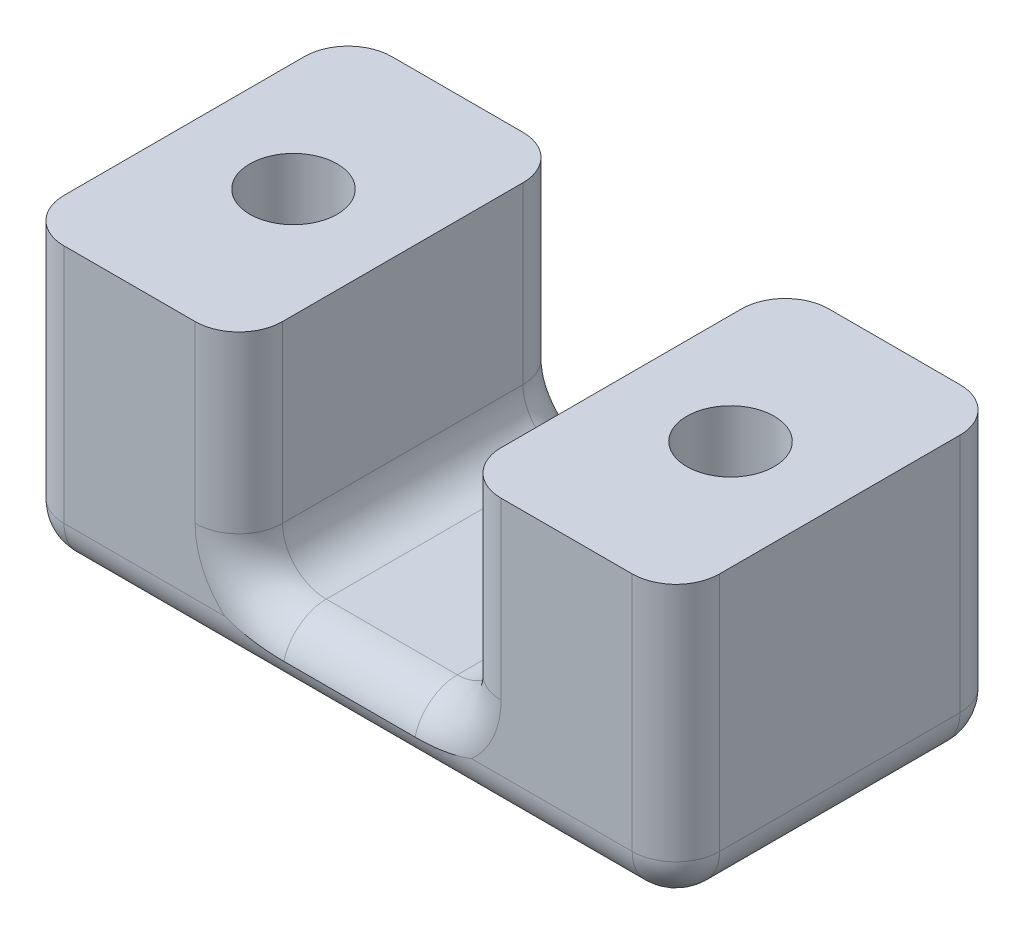
ISO-10303-21;
HEADER;
FILE_DESCRIPTION(('STEP AP214'),'2;1');
FILE_NAME('part.step','',(''),(''),'','','');
FILE_SCHEMA(('AUTOMOTIVE_DESIGN { 1 0 10303 214 1 1 1 1 }'));
ENDSEC;
DATA;
#1=APPLICATION_CONTEXT('core data for automotive mechanical design processes');
#2=APPLICATION_PROTOCOL_DEFINITION('international standard','automotive_design',2000,#1);
#3=PRODUCT_CONTEXT('',#1,'mechanical');
#4=PRODUCT('Part','Part','',(#3));
#5=PRODUCT_RELATED_PRODUCT_CATEGORY('part','',(#4));
#6=PRODUCT_DEFINITION_FORMATION('','',#4);
#7=PRODUCT_DEFINITION_CONTEXT('part definition',#1,'design');
#8=PRODUCT_DEFINITION('design','',#6,#7);
#9=PRODUCT_DEFINITION_SHAPE('','',#8);
#10=(LENGTH_UNIT() NAMED_UNIT(*) SI_UNIT(.MILLI.,.METRE.));
#11=(NAMED_UNIT(*) PLANE_ANGLE_UNIT() SI_UNIT($,.RADIAN.));
#12=(NAMED_UNIT(*) SI_UNIT($,.STERADIAN.) SOLID_ANGLE_UNIT());
#13=UNCERTAINTY_MEASURE_WITH_UNIT(LENGTH_MEASURE(1.E-05),#10,'distance_accuracy_value','');
#14=(GEOMETRIC_REPRESENTATION_CONTEXT(3) GLOBAL_UNCERTAINTY_ASSIGNED_CONTEXT((#13)) GLOBAL_UNIT_ASSIGNED_CONTEXT((#10,
#11,#12)) REPRESENTATION_CONTEXT('',''));
#15=CARTESIAN_POINT('',(0.,0.,0.));
#16=DIRECTION('',(0.,0.,1.));
#17=DIRECTION('',(1.,0.,0.));
#18=AXIS2_PLACEMENT_3D('',#15,#16,#17);
#19=CARTESIAN_POINT('',(0.,3.,-15.));
#20=DIRECTION('',(0.,0.,1.));
#21=DIRECTION('',(1.,0.,0.));
#22=AXIS2_PLACEMENT_3D('',#19,#20,#21);
#23=PLANE('',#22);
#24=CARTESIAN_POINT('',(18.,5.,-15.));
#25=DIRECTION('',(0.,0.,1.));
#26=DIRECTION('',(1.,0.,0.));
#27=AXIS2_PLACEMENT_3D('',#24,#25,#26);
#28=CIRCLE('',#27,4.);
#29=CARTESIAN_POINT('',(20.6457513110646,2.,-15.));
#30=VERTEX_POINT('',#29);
#31=CARTESIAN_POINT('',(22.,5.,-15.));
#32=VERTEX_POINT('',#31);
#33=EDGE_CURVE('E561',#30,#32,#28,.T.);
#34=ORIENTED_EDGE('',*,*,#33,.T.);
#35=DIRECTION('',(0.,-1.,0.));
#36=VECTOR('',#35,1.);
#37=CARTESIAN_POINT('',(22.,3.,-15.));
#38=LINE('',#37,#36);
#39=CARTESIAN_POINT('',(22.,13.,-15.));
#40=VERTEX_POINT('',#39);
#41=EDGE_CURVE('E564',#32,#40,#38,.F.);
#42=ORIENTED_EDGE('',*,*,#41,.T.);
#43=DIRECTION('',(-1.,0.,0.));
#44=VECTOR('',#43,1.);
#45=CARTESIAN_POINT('',(30.,13.,-15.));
#46=LINE('',#45,#44);
#47=CARTESIAN_POINT('',(28.,13.,-15.));
#48=VERTEX_POINT('',#47);
#49=EDGE_CURVE('E443',#48,#40,#46,.T.);
#50=ORIENTED_EDGE('',*,*,#49,.F.);
#51=DIRECTION('',(0.,-1.,0.));
#52=VECTOR('',#51,1.);
#53=CARTESIAN_POINT('',(28.,3.,-15.));
#54=LINE('',#53,#52);
#55=CARTESIAN_POINT('',(28.,2.,-15.));
#56=VERTEX_POINT('',#55);
#57=EDGE_CURVE('E558',#48,#56,#54,.T.);
#58=ORIENTED_EDGE('',*,*,#57,.T.);
#59=DIRECTION('',(-1.,0.,0.));
#60=VECTOR('',#59,1.);
#61=CARTESIAN_POINT('',(0.,2.,-15.));
#62=LINE('',#61,#60);
#63=EDGE_CURVE('E555',#56,#30,#62,.T.);
#64=ORIENTED_EDGE('',*,*,#63,.T.);
#65=EDGE_LOOP('',(#34,#42,#50,#58,#64));
#66=FACE_BOUND('',#65,.T.);
#67=ADVANCED_FACE('F41',(#66),#23,.F.);
#68=CARTESIAN_POINT('',(0.,3.,0.));
#69=DIRECTION('',(0.,0.,-1.));
#70=DIRECTION('',(-1.,0.,0.));
#71=AXIS2_PLACEMENT_3D('',#68,#69,#70);
#72=PLANE('',#71);
#73=CARTESIAN_POINT('',(12.,5.,0.));
#74=DIRECTION('',(0.,0.,-1.));
#75=DIRECTION('',(-1.,0.,0.));
#76=AXIS2_PLACEMENT_3D('',#73,#74,#75);
#77=CIRCLE('',#76,4.);
#78=CARTESIAN_POINT('',(9.35424868893541,2.,0.));
#79=VERTEX_POINT('',#78);
#80=CARTESIAN_POINT('',(8.,5.,0.));
#81=VERTEX_POINT('',#80);
#82=EDGE_CURVE('E505',#79,#81,#77,.T.);
#83=ORIENTED_EDGE('',*,*,#82,.T.);
#84=DIRECTION('',(0.,-1.,0.));
#85=VECTOR('',#84,1.);
#86=CARTESIAN_POINT('',(8.,3.,0.));
#87=LINE('',#86,#85);
#88=CARTESIAN_POINT('',(8.,13.,0.));
#89=VERTEX_POINT('',#88);
#90=EDGE_CURVE('E508',#81,#89,#87,.F.);
#91=ORIENTED_EDGE('',*,*,#90,.T.);
#92=DIRECTION('',(1.,0.,0.));
#93=VECTOR('',#92,1.);
#94=CARTESIAN_POINT('',(0.,13.,0.));
#95=LINE('',#94,#93);
#96=CARTESIAN_POINT('',(2.,13.,0.));
#97=VERTEX_POINT('',#96);
#98=EDGE_CURVE('E460',#97,#89,#95,.T.);
#99=ORIENTED_EDGE('',*,*,#98,.F.);
#100=DIRECTION('',(0.,-1.,0.));
#101=VECTOR('',#100,1.);
#102=CARTESIAN_POINT('',(2.,3.,0.));
#103=LINE('',#102,#101);
#104=CARTESIAN_POINT('',(2.,2.,0.));
#105=VERTEX_POINT('',#104);
#106=EDGE_CURVE('E502',#97,#105,#103,.T.);
#107=ORIENTED_EDGE('',*,*,#106,.T.);
#108=DIRECTION('',(1.,0.,0.));
#109=VECTOR('',#108,1.);
#110=CARTESIAN_POINT('',(30.,2.,0.));
#111=LINE('',#110,#109);
#112=EDGE_CURVE('E499',#105,#79,#111,.T.);
#113=ORIENTED_EDGE('',*,*,#112,.T.);
#114=EDGE_LOOP('',(#83,#91,#99,#107,#113));
#115=FACE_BOUND('',#114,.T.);
#116=ADVANCED_FACE('F621',(#115),#72,.F.);
#117=CARTESIAN_POINT('',(0.,3.,0.));
#118=DIRECTION('',(0.,-1.,0.));
#119=DIRECTION('',(0.,0.,-1.));
#120=AXIS2_PLACEMENT_3D('',#117,#118,#119);
#121=PLANE('',#120);
#122=DIRECTION('',(0.,0.,-1.));
#123=VECTOR('',#122,1.);
#124=CARTESIAN_POINT('',(12.,3.,0.));
#125=LINE('',#124,#123);
#126=CARTESIAN_POINT('',(12.,3.,-13.));
#127=VERTEX_POINT('',#126);
#128=CARTESIAN_POINT('',(12.,3.,-2.));
#129=VERTEX_POINT('',#128);
#130=EDGE_CURVE('E573',#127,#129,#125,.F.);
#131=ORIENTED_EDGE('',*,*,#130,.T.);
#132=DIRECTION('',(1.,0.,0.));
#133=VECTOR('',#132,1.);
#134=CARTESIAN_POINT('',(0.,3.,-2.));
#135=LINE('',#134,#133);
#136=CARTESIAN_POINT('',(18.,3.,-2.));
#137=VERTEX_POINT('',#136);
#138=EDGE_CURVE('E576',#129,#137,#135,.T.);
#139=ORIENTED_EDGE('',*,*,#138,.T.);
#140=DIRECTION('',(0.,0.,1.));
#141=VECTOR('',#140,1.);
#142=CARTESIAN_POINT('',(18.,3.,-15.));
#143=LINE('',#142,#141);
#144=CARTESIAN_POINT('',(18.,3.,-13.));
#145=VERTEX_POINT('',#144);
#146=EDGE_CURVE('E567',#137,#145,#143,.F.);
#147=ORIENTED_EDGE('',*,*,#146,.T.);
#148=DIRECTION('',(-1.,0.,0.));
#149=VECTOR('',#148,1.);
#150=CARTESIAN_POINT('',(0.,3.,-13.));
#151=LINE('',#150,#149);
#152=EDGE_CURVE('E570',#145,#127,#151,.T.);
#153=ORIENTED_EDGE('',*,*,#152,.T.);
#154=EDGE_LOOP('',(#131,#139,#147,#153));
#155=FACE_BOUND('',#154,.T.);
#156=ADVANCED_FACE('F706',(#155),#121,.F.);
#157=CARTESIAN_POINT('',(0.,3.,0.));
#158=DIRECTION('',(1.,0.,0.));
#159=DIRECTION('',(0.,0.,-1.));
#160=AXIS2_PLACEMENT_3D('',#157,#158,#159);
#161=PLANE('',#160);
#162=DIRECTION('',(0.,0.,1.));
#163=VECTOR('',#162,1.);
#164=CARTESIAN_POINT('',(0.,2.,0.));
#165=LINE('',#164,#163);
#166=CARTESIAN_POINT('',(0.,2.,-13.));
#167=VERTEX_POINT('',#166);
#168=CARTESIAN_POINT('',(0.,2.,-2.));
#169=VERTEX_POINT('',#168);
#170=EDGE_CURVE('E52',#167,#169,#165,.T.);
#171=ORIENTED_EDGE('',*,*,#170,.T.);
#172=DIRECTION('',(0.,-1.,0.));
#173=VECTOR('',#172,1.);
#174=CARTESIAN_POINT('',(0.,3.,-2.));
#175=LINE('',#174,#173);
#176=CARTESIAN_POINT('',(0.,13.,-2.));
#177=VERTEX_POINT('',#176);
#178=EDGE_CURVE('E11',#169,#177,#175,.F.);
#179=ORIENTED_EDGE('',*,*,#178,.T.);
#180=DIRECTION('',(0.,0.,1.));
#181=VECTOR('',#180,1.);
#182=CARTESIAN_POINT('',(0.,13.,-15.));
#183=LINE('',#182,#181);
#184=CARTESIAN_POINT('',(0.,13.,-13.));
#185=VERTEX_POINT('',#184);
#186=EDGE_CURVE('E456',#185,#177,#183,.T.);
#187=ORIENTED_EDGE('',*,*,#186,.F.);
#188=DIRECTION('',(0.,-1.,0.));
#189=VECTOR('',#188,1.);
#190=CARTESIAN_POINT('',(0.,3.,-13.));
#191=LINE('',#190,#189);
#192=EDGE_CURVE('E229',#185,#167,#191,.T.);
#193=ORIENTED_EDGE('',*,*,#192,.T.);
#194=EDGE_LOOP('',(#171,#179,#187,#193));
#195=FACE_BOUND('',#194,.T.);
#196=ADVANCED_FACE('F648',(#195),#161,.F.);
#197=DIRECTION('',(1.,0.,0.));
#198=VECTOR('',#197,1.);
#199=CARTESIAN_POINT('',(30.,13.,0.));
#200=LINE('',#199,#198);
#201=CARTESIAN_POINT('',(22.,13.,0.));
#202=VERTEX_POINT('',#201);
#203=CARTESIAN_POINT('',(28.,13.,0.));
#204=VERTEX_POINT('',#203);
#205=EDGE_CURVE('E452',#202,#204,#200,.T.);
#206=ORIENTED_EDGE('',*,*,#205,.F.);
#207=DIRECTION('',(0.,-1.,0.));
#208=VECTOR('',#207,1.);
#209=CARTESIAN_POINT('',(22.,3.,0.));
#210=LINE('',#209,#208);
#211=CARTESIAN_POINT('',(22.,5.,0.));
#212=VERTEX_POINT('',#211);
#213=EDGE_CURVE('E495',#202,#212,#210,.T.);
#214=ORIENTED_EDGE('',*,*,#213,.T.);
#215=CARTESIAN_POINT('',(18.,5.,0.));
#216=DIRECTION('',(0.,0.,-1.));
#217=DIRECTION('',(-1.,0.,0.));
#218=AXIS2_PLACEMENT_3D('',#215,#216,#217);
#219=CIRCLE('',#218,4.);
#220=CARTESIAN_POINT('',(20.6457513110646,2.,0.));
#221=VERTEX_POINT('',#220);
#222=EDGE_CURVE('E492',#212,#221,#219,.T.);
#223=ORIENTED_EDGE('',*,*,#222,.T.);
#224=DIRECTION('',(1.,0.,0.));
#225=VECTOR('',#224,1.);
#226=CARTESIAN_POINT('',(30.,2.,0.));
#227=LINE('',#226,#225);
#228=CARTESIAN_POINT('',(28.,2.,0.));
#229=VERTEX_POINT('',#228);
#230=EDGE_CURVE('E486',#221,#229,#227,.T.);
#231=ORIENTED_EDGE('',*,*,#230,.T.);
#232=DIRECTION('',(0.,-1.,0.));
#233=VECTOR('',#232,1.);
#234=CARTESIAN_POINT('',(28.,3.,0.));
#235=LINE('',#234,#233);
#236=EDGE_CURVE('E489',#229,#204,#235,.F.);
#237=ORIENTED_EDGE('',*,*,#236,.T.);
#238=EDGE_LOOP('',(#206,#214,#223,#231,#237));
#239=FACE_BOUND('',#238,.T.);
#240=ADVANCED_FACE('F597',(#239),#72,.F.);
#241=CARTESIAN_POINT('',(30.,3.,0.));
#242=DIRECTION('',(-1.,0.,0.));
#243=DIRECTION('',(0.,0.,1.));
#244=AXIS2_PLACEMENT_3D('',#241,#242,#243);
#245=PLANE('',#244);
#246=DIRECTION('',(0.,0.,-1.));
#247=VECTOR('',#246,1.);
#248=CARTESIAN_POINT('',(30.,13.,-15.));
#249=LINE('',#248,#247);
#250=CARTESIAN_POINT('',(30.,13.,-2.));
#251=VERTEX_POINT('',#250);
#252=CARTESIAN_POINT('',(30.,13.,-13.));
#253=VERTEX_POINT('',#252);
#254=EDGE_CURVE('E439',#251,#253,#249,.T.);
#255=ORIENTED_EDGE('',*,*,#254,.F.);
#256=DIRECTION('',(0.,-1.,0.));
#257=VECTOR('',#256,1.);
#258=CARTESIAN_POINT('',(30.,3.,-2.));
#259=LINE('',#258,#257);
#260=CARTESIAN_POINT('',(30.,2.,-2.));
#261=VERTEX_POINT('',#260);
#262=EDGE_CURVE('E585',#251,#261,#259,.T.);
#263=ORIENTED_EDGE('',*,*,#262,.T.);
#264=DIRECTION('',(0.,0.,-1.));
#265=VECTOR('',#264,1.);
#266=CARTESIAN_POINT('',(30.,2.,-15.));
#267=LINE('',#266,#265);
#268=CARTESIAN_POINT('',(30.,2.,-13.));
#269=VERTEX_POINT('',#268);
#270=EDGE_CURVE('E248',#261,#269,#267,.T.);
#271=ORIENTED_EDGE('',*,*,#270,.T.);
#272=DIRECTION('',(0.,-1.,0.));
#273=VECTOR('',#272,1.);
#274=CARTESIAN_POINT('',(30.,3.,-13.));
#275=LINE('',#274,#273);
#276=EDGE_CURVE('E582',#269,#253,#275,.F.);
#277=ORIENTED_EDGE('',*,*,#276,.T.);
#278=EDGE_LOOP('',(#255,#263,#271,#277));
#279=FACE_BOUND('',#278,.T.);
#280=ADVANCED_FACE('F591',(#279),#245,.F.);
#281=DIRECTION('',(-1.,0.,0.));
#282=VECTOR('',#281,1.);
#283=CARTESIAN_POINT('',(0.,13.,-15.));
#284=LINE('',#283,#282);
#285=CARTESIAN_POINT('',(8.,13.,-15.));
#286=VERTEX_POINT('',#285);
#287=CARTESIAN_POINT('',(2.,13.,-15.));
#288=VERTEX_POINT('',#287);
#289=EDGE_CURVE('E466',#286,#288,#284,.T.);
#290=ORIENTED_EDGE('',*,*,#289,.F.);
#291=DIRECTION('',(0.,-1.,0.));
#292=VECTOR('',#291,1.);
#293=CARTESIAN_POINT('',(8.,3.,-15.));
#294=LINE('',#293,#292);
#295=CARTESIAN_POINT('',(8.,5.,-15.));
#296=VERTEX_POINT('',#295);
#297=EDGE_CURVE('E552',#286,#296,#294,.T.);
#298=ORIENTED_EDGE('',*,*,#297,.T.);
#299=CARTESIAN_POINT('',(12.,5.,-15.));
#300=DIRECTION('',(0.,0.,1.));
#301=DIRECTION('',(1.,0.,0.));
#302=AXIS2_PLACEMENT_3D('',#299,#300,#301);
#303=CIRCLE('',#302,4.);
#304=CARTESIAN_POINT('',(9.35424868893541,2.,-15.));
#305=VERTEX_POINT('',#304);
#306=EDGE_CURVE('E549',#296,#305,#303,.T.);
#307=ORIENTED_EDGE('',*,*,#306,.T.);
#308=DIRECTION('',(-1.,0.,0.));
#309=VECTOR('',#308,1.);
#310=CARTESIAN_POINT('',(0.,2.,-15.));
#311=LINE('',#310,#309);
#312=CARTESIAN_POINT('',(2.,2.,-15.));
#313=VERTEX_POINT('',#312);
#314=EDGE_CURVE('E543',#305,#313,#311,.T.);
#315=ORIENTED_EDGE('',*,*,#314,.T.);
#316=DIRECTION('',(0.,-1.,0.));
#317=VECTOR('',#316,1.);
#318=CARTESIAN_POINT('',(2.,3.,-15.));
#319=LINE('',#318,#317);
#320=EDGE_CURVE('E546',#313,#288,#319,.F.);
#321=ORIENTED_EDGE('',*,*,#320,.T.);
#322=EDGE_LOOP('',(#290,#298,#307,#315,#321));
#323=FACE_BOUND('',#322,.T.);
#324=ADVANCED_FACE('F638',(#323),#23,.F.);
#325=CARTESIAN_POINT('',(0.,0.,0.));
#326=DIRECTION('',(0.,-1.,0.));
#327=DIRECTION('',(0.,0.,-1.));
#328=AXIS2_PLACEMENT_3D('',#325,#326,#327);
#329=PLANE('',#328);
#330=DIRECTION('',(0.,0.,-1.));
#331=VECTOR('',#330,1.);
#332=CARTESIAN_POINT('',(28.,0.,0.));
#333=LINE('',#332,#331);
#334=CARTESIAN_POINT('',(28.,0.,-13.));
#335=VERTEX_POINT('',#334);
#336=CARTESIAN_POINT('',(28.,0.,-2.));
#337=VERTEX_POINT('',#336);
#338=EDGE_CURVE('E230',#335,#337,#333,.F.);
#339=ORIENTED_EDGE('',*,*,#338,.T.);
#340=DIRECTION('',(1.,0.,0.));
#341=VECTOR('',#340,1.);
#342=CARTESIAN_POINT('',(0.,0.,-2.));
#343=LINE('',#342,#341);
#344=CARTESIAN_POINT('',(2.,0.,-2.));
#345=VERTEX_POINT('',#344);
#346=EDGE_CURVE('E216',#337,#345,#343,.F.);
#347=ORIENTED_EDGE('',*,*,#346,.T.);
#348=DIRECTION('',(0.,0.,1.));
#349=VECTOR('',#348,1.);
#350=CARTESIAN_POINT('',(2.,0.,-15.));
#351=LINE('',#350,#349);
#352=CARTESIAN_POINT('',(2.,0.,-13.));
#353=VERTEX_POINT('',#352);
#354=EDGE_CURVE('E258',#345,#353,#351,.F.);
#355=ORIENTED_EDGE('',*,*,#354,.T.);
#356=DIRECTION('',(-1.,0.,0.));
#357=VECTOR('',#356,1.);
#358=CARTESIAN_POINT('',(30.,0.,-13.));
#359=LINE('',#358,#357);
#360=EDGE_CURVE('E255',#353,#335,#359,.F.);
#361=ORIENTED_EDGE('',*,*,#360,.T.);
#362=EDGE_LOOP('',(#339,#347,#355,#361));
#363=FACE_BOUND('',#362,.T.);
#364=CARTESIAN_POINT('',(5.,0.,-7.5));
#365=DIRECTION('',(0.,-1.,0.));
#366=DIRECTION('',(0.,0.,-1.));
#367=AXIS2_PLACEMENT_3D('',#364,#365,#366);
#368=CIRCLE('',#367,2.);
#369=CARTESIAN_POINT('',(5.,0.,-9.5));
#370=VERTEX_POINT('',#369);
#371=EDGE_CURVE('E430',#370,#370,#368,.T.);
#372=ORIENTED_EDGE('',*,*,#371,.F.);
#373=EDGE_LOOP('',(#372));
#374=FACE_BOUND('',#373,.T.);
#375=CARTESIAN_POINT('',(25.,0.,-7.49999999999999));
#376=DIRECTION('',(0.,-1.,0.));
#377=DIRECTION('',(0.,0.,1.));
#378=AXIS2_PLACEMENT_3D('',#375,#376,#377);
#379=CIRCLE('',#378,2.);
#380=CARTESIAN_POINT('',(25.,0.,-5.49999999999999));
#381=VERTEX_POINT('',#380);
#382=EDGE_CURVE('E425',#381,#381,#379,.T.);
#383=ORIENTED_EDGE('',*,*,#382,.F.);
#384=EDGE_LOOP('',(#383));
#385=FACE_BOUND('',#384,.T.);
#386=ADVANCED_FACE('F252',(#363,#374,#385),#329,.T.);
#387=CARTESIAN_POINT('',(10.,13.,-15.));
#388=DIRECTION('',(-1.,0.,0.));
#389=DIRECTION('',(0.,0.,1.));
#390=AXIS2_PLACEMENT_3D('',#387,#388,#389);
#391=PLANE('',#390);
#392=DIRECTION('',(0.,0.,-1.));
#393=VECTOR('',#392,1.);
#394=CARTESIAN_POINT('',(10.,13.,-15.));
#395=LINE('',#394,#393);
#396=CARTESIAN_POINT('',(10.,13.,-2.));
#397=VERTEX_POINT('',#396);
#398=CARTESIAN_POINT('',(10.,13.,-13.));
#399=VERTEX_POINT('',#398);
#400=EDGE_CURVE('E463',#397,#399,#395,.T.);
#401=ORIENTED_EDGE('',*,*,#400,.F.);
#402=DIRECTION('',(0.,-1.,0.));
#403=VECTOR('',#402,1.);
#404=CARTESIAN_POINT('',(10.,13.,-2.));
#405=LINE('',#404,#403);
#406=CARTESIAN_POINT('',(10.,5.,-2.));
#407=VERTEX_POINT('',#406);
#408=EDGE_CURVE('E482',#397,#407,#405,.T.);
#409=ORIENTED_EDGE('',*,*,#408,.T.);
#410=DIRECTION('',(0.,0.,-1.));
#411=VECTOR('',#410,1.);
#412=CARTESIAN_POINT('',(10.,5.,-15.));
#413=LINE('',#412,#411);
#414=CARTESIAN_POINT('',(10.,5.,-13.));
#415=VERTEX_POINT('',#414);
#416=EDGE_CURVE('E470',#407,#415,#413,.T.);
#417=ORIENTED_EDGE('',*,*,#416,.T.);
#418=DIRECTION('',(0.,-1.,0.));
#419=VECTOR('',#418,1.);
#420=CARTESIAN_POINT('',(10.,13.,-13.));
#421=LINE('',#420,#419);
#422=EDGE_CURVE('E479',#415,#399,#421,.F.);
#423=ORIENTED_EDGE('',*,*,#422,.T.);
#424=EDGE_LOOP('',(#401,#409,#417,#423));
#425=FACE_BOUND('',#424,.T.);
#426=ADVANCED_FACE('F626',(#425),#391,.F.);
#427=CARTESIAN_POINT('',(0.,13.,0.));
#428=DIRECTION('',(0.,1.,0.));
#429=DIRECTION('',(0.,0.,1.));
#430=AXIS2_PLACEMENT_3D('',#427,#428,#429);
#431=PLANE('',#430);
#432=CARTESIAN_POINT('',(5.,13.,-7.5));
#433=DIRECTION('',(0.,1.,0.));
#434=DIRECTION('',(0.,0.,1.));
#435=AXIS2_PLACEMENT_3D('',#432,#433,#434);
#436=CIRCLE('',#435,2.);
#437=CARTESIAN_POINT('',(5.,13.,-5.5));
#438=VERTEX_POINT('',#437);
#439=EDGE_CURVE('E444',#438,#438,#436,.T.);
#440=ORIENTED_EDGE('',*,*,#439,.F.);
#441=EDGE_LOOP('',(#440));
#442=FACE_BOUND('',#441,.T.);
#443=ORIENTED_EDGE('',*,*,#98,.T.);
#444=CARTESIAN_POINT('',(8.,13.,-2.));
#445=DIRECTION('',(0.,1.,0.));
#446=DIRECTION('',(0.,0.,1.));
#447=AXIS2_PLACEMENT_3D('',#444,#445,#446);
#448=CIRCLE('',#447,2.);
#449=EDGE_CURVE('E92',#89,#397,#448,.T.);
#450=ORIENTED_EDGE('',*,*,#449,.T.);
#451=ORIENTED_EDGE('',*,*,#400,.T.);
#452=CARTESIAN_POINT('',(8.,13.,-13.));
#453=DIRECTION('',(0.,1.,0.));
#454=DIRECTION('',(0.,0.,1.));
#455=AXIS2_PLACEMENT_3D('',#452,#453,#454);
#456=CIRCLE('',#455,2.);
#457=EDGE_CURVE('E517',#399,#286,#456,.T.);
#458=ORIENTED_EDGE('',*,*,#457,.T.);
#459=ORIENTED_EDGE('',*,*,#289,.T.);
#460=CARTESIAN_POINT('',(2.,13.,-13.));
#461=DIRECTION('',(0.,1.,0.));
#462=DIRECTION('',(0.,0.,1.));
#463=AXIS2_PLACEMENT_3D('',#460,#461,#462);
#464=CIRCLE('',#463,2.);
#465=EDGE_CURVE('E511',#288,#185,#464,.T.);
#466=ORIENTED_EDGE('',*,*,#465,.T.);
#467=ORIENTED_EDGE('',*,*,#186,.T.);
#468=CARTESIAN_POINT('',(2.,13.,-2.));
#469=DIRECTION('',(0.,1.,0.));
#470=DIRECTION('',(0.,0.,1.));
#471=AXIS2_PLACEMENT_3D('',#468,#469,#470);
#472=CIRCLE('',#471,2.);
#473=EDGE_CURVE('E514',#177,#97,#472,.T.);
#474=ORIENTED_EDGE('',*,*,#473,.T.);
#475=EDGE_LOOP('',(#443,#450,#451,#458,#459,#466,#467,#474));
#476=FACE_BOUND('',#475,.T.);
#477=ADVANCED_FACE('F630',(#442,#476),#431,.T.);
#478=CARTESIAN_POINT('',(20.,13.,-15.));
#479=DIRECTION('',(1.,0.,0.));
#480=DIRECTION('',(0.,0.,-1.));
#481=AXIS2_PLACEMENT_3D('',#478,#479,#480);
#482=PLANE('',#481);
#483=DIRECTION('',(0.,0.,1.));
#484=VECTOR('',#483,1.);
#485=CARTESIAN_POINT('',(20.,5.,0.));
#486=LINE('',#485,#484);
#487=CARTESIAN_POINT('',(20.,5.,-13.));
#488=VERTEX_POINT('',#487);
#489=CARTESIAN_POINT('',(20.,5.,-2.));
#490=VERTEX_POINT('',#489);
#491=EDGE_CURVE('E522',#488,#490,#486,.T.);
#492=ORIENTED_EDGE('',*,*,#491,.T.);
#493=DIRECTION('',(0.,-1.,0.));
#494=VECTOR('',#493,1.);
#495=CARTESIAN_POINT('',(20.,13.,-2.));
#496=LINE('',#495,#494);
#497=CARTESIAN_POINT('',(20.,13.,-2.));
#498=VERTEX_POINT('',#497);
#499=EDGE_CURVE('E528',#490,#498,#496,.F.);
#500=ORIENTED_EDGE('',*,*,#499,.T.);
#501=DIRECTION('',(0.,0.,1.));
#502=VECTOR('',#501,1.);
#503=CARTESIAN_POINT('',(20.,13.,-15.));
#504=LINE('',#503,#502);
#505=CARTESIAN_POINT('',(20.,13.,-13.));
#506=VERTEX_POINT('',#505);
#507=EDGE_CURVE('E448',#506,#498,#504,.T.);
#508=ORIENTED_EDGE('',*,*,#507,.F.);
#509=DIRECTION('',(0.,-1.,0.));
#510=VECTOR('',#509,1.);
#511=CARTESIAN_POINT('',(20.,13.,-13.));
#512=LINE('',#511,#510);
#513=EDGE_CURVE('E525',#506,#488,#512,.T.);
#514=ORIENTED_EDGE('',*,*,#513,.T.);
#515=EDGE_LOOP('',(#492,#500,#508,#514));
#516=FACE_BOUND('',#515,.T.);
#517=ADVANCED_FACE('F680',(#516),#482,.F.);
#518=CARTESIAN_POINT('',(0.,13.,0.));
#519=DIRECTION('',(0.,-1.,0.));
#520=DIRECTION('',(0.,0.,-1.));
#521=AXIS2_PLACEMENT_3D('',#518,#519,#520);
#522=PLANE('',#521);
#523=CARTESIAN_POINT('',(25.,13.,-7.49999999999999));
#524=DIRECTION('',(0.,-1.,0.));
#525=DIRECTION('',(0.,0.,-1.));
#526=AXIS2_PLACEMENT_3D('',#523,#524,#525);
#527=CIRCLE('',#526,2.);
#528=CARTESIAN_POINT('',(25.,13.,-9.49999999999999));
#529=VERTEX_POINT('',#528);
#530=EDGE_CURVE('E436',#529,#529,#527,.T.);
#531=ORIENTED_EDGE('',*,*,#530,.T.);
#532=EDGE_LOOP('',(#531));
#533=FACE_BOUND('',#532,.T.);
#534=ORIENTED_EDGE('',*,*,#507,.T.);
#535=CARTESIAN_POINT('',(22.,13.,-2.));
#536=DIRECTION('',(0.,-1.,0.));
#537=DIRECTION('',(0.,0.,-1.));
#538=AXIS2_PLACEMENT_3D('',#535,#536,#537);
#539=CIRCLE('',#538,2.);
#540=EDGE_CURVE('E540',#498,#202,#539,.F.);
#541=ORIENTED_EDGE('',*,*,#540,.T.);
#542=ORIENTED_EDGE('',*,*,#205,.T.);
#543=CARTESIAN_POINT('',(28.,13.,-2.));
#544=DIRECTION('',(0.,-1.,0.));
#545=DIRECTION('',(0.,0.,-1.));
#546=AXIS2_PLACEMENT_3D('',#543,#544,#545);
#547=CIRCLE('',#546,2.);
#548=EDGE_CURVE('E534',#204,#251,#547,.F.);
#549=ORIENTED_EDGE('',*,*,#548,.T.);
#550=ORIENTED_EDGE('',*,*,#254,.T.);
#551=CARTESIAN_POINT('',(28.,13.,-13.));
#552=DIRECTION('',(0.,-1.,0.));
#553=DIRECTION('',(0.,0.,-1.));
#554=AXIS2_PLACEMENT_3D('',#551,#552,#553);
#555=CIRCLE('',#554,2.);
#556=EDGE_CURVE('E531',#253,#48,#555,.F.);
#557=ORIENTED_EDGE('',*,*,#556,.T.);
#558=ORIENTED_EDGE('',*,*,#49,.T.);
#559=CARTESIAN_POINT('',(22.,13.,-13.));
#560=DIRECTION('',(0.,-1.,0.));
#561=DIRECTION('',(0.,0.,-1.));
#562=AXIS2_PLACEMENT_3D('',#559,#560,#561);
#563=CIRCLE('',#562,2.);
#564=EDGE_CURVE('E537',#40,#506,#563,.F.);
#565=ORIENTED_EDGE('',*,*,#564,.T.);
#566=EDGE_LOOP('',(#534,#541,#542,#549,#550,#557,#558,#565));
#567=FACE_BOUND('',#566,.T.);
#568=ADVANCED_FACE('F600',(#533,#567),#522,.F.);
#569=CARTESIAN_POINT('',(25.,30.,-7.49999999999999));
#570=DIRECTION('',(0.,-1.,0.));
#571=DIRECTION('',(0.,0.,-1.));
#572=AXIS2_PLACEMENT_3D('',#569,#570,#571);
#573=CYLINDRICAL_SURFACE('',#572,2.);
#574=ORIENTED_EDGE('',*,*,#382,.T.);
#575=EDGE_LOOP('',(#574));
#576=FACE_BOUND('',#575,.T.);
#577=ORIENTED_EDGE('',*,*,#530,.F.);
#578=EDGE_LOOP('',(#577));
#579=FACE_BOUND('',#578,.T.);
#580=ADVANCED_FACE('F847',(#576,#579),#573,.F.);
#581=CARTESIAN_POINT('',(5.,30.,-7.5));
#582=DIRECTION('',(0.,-1.,0.));
#583=DIRECTION('',(0.,0.,-1.));
#584=AXIS2_PLACEMENT_3D('',#581,#582,#583);
#585=CYLINDRICAL_SURFACE('',#584,2.);
#586=ORIENTED_EDGE('',*,*,#439,.T.);
#587=EDGE_LOOP('',(#586));
#588=FACE_BOUND('',#587,.T.);
#589=ORIENTED_EDGE('',*,*,#371,.T.);
#590=EDGE_LOOP('',(#589));
#591=FACE_BOUND('',#590,.T.);
#592=ADVANCED_FACE('F837',(#588,#591),#585,.F.);
#593=CARTESIAN_POINT('',(22.,13.,-13.));
#594=DIRECTION('',(0.,-1.,0.));
#595=DIRECTION('',(0.,0.,-1.));
#596=AXIS2_PLACEMENT_3D('',#593,#594,#595);
#597=CYLINDRICAL_SURFACE('',#596,2.);
#598=ORIENTED_EDGE('',*,*,#564,.F.);
#599=ORIENTED_EDGE('',*,*,#41,.F.);
#600=CARTESIAN_POINT('',(22.,5.,-13.));
#601=DIRECTION('',(0.,-1.,0.));
#602=DIRECTION('',(0.,0.,-1.));
#603=AXIS2_PLACEMENT_3D('',#600,#601,#602);
#604=CIRCLE('',#603,2.);
#605=EDGE_CURVE('E45',#488,#32,#604,.T.);
#606=ORIENTED_EDGE('',*,*,#605,.F.);
#607=ORIENTED_EDGE('',*,*,#513,.F.);
#608=EDGE_LOOP('',(#598,#599,#606,#607));
#609=FACE_BOUND('',#608,.T.);
#610=ADVANCED_FACE('F43',(#609),#597,.T.);
#611=CARTESIAN_POINT('',(28.,3.,-13.));
#612=DIRECTION('',(0.,-1.,0.));
#613=DIRECTION('',(0.,0.,-1.));
#614=AXIS2_PLACEMENT_3D('',#611,#612,#613);
#615=CYLINDRICAL_SURFACE('',#614,2.);
#616=ORIENTED_EDGE('',*,*,#556,.F.);
#617=ORIENTED_EDGE('',*,*,#276,.F.);
#618=CARTESIAN_POINT('',(28.,2.,-13.));
#619=DIRECTION('',(0.,-1.,0.));
#620=DIRECTION('',(0.,0.,-1.));
#621=AXIS2_PLACEMENT_3D('',#618,#619,#620);
#622=CIRCLE('',#621,2.);
#623=EDGE_CURVE('E416',#56,#269,#622,.T.);
#624=ORIENTED_EDGE('',*,*,#623,.F.);
#625=ORIENTED_EDGE('',*,*,#57,.F.);
#626=EDGE_LOOP('',(#616,#617,#624,#625));
#627=FACE_BOUND('',#626,.T.);
#628=ADVANCED_FACE('F394',(#627),#615,.T.);
#629=CARTESIAN_POINT('',(18.,5.,-13.));
#630=DIRECTION('',(0.,0.,1.));
#631=DIRECTION('',(1.,0.,0.));
#632=AXIS2_PLACEMENT_3D('',#629,#630,#631);
#633=TOROIDAL_SURFACE('',#632,4.,2.);
#634=ORIENTED_EDGE('',*,*,#605,.T.);
#635=ORIENTED_EDGE('',*,*,#33,.F.);
#636=CARTESIAN_POINT('',(20.6457513110646,2.,-15.));
#637=CARTESIAN_POINT('',(20.6423222120228,1.99870391793359,-14.9999999945555));
#638=CARTESIAN_POINT('',(20.6388922528748,1.99741003510526,-14.9999987348855));
#639=CARTESIAN_POINT('',(20.4269095991489,1.91759999996282,-14.9998441615928));
#640=CARTESIAN_POINT('',(20.2151898093873,1.84722442227896,-14.9951026692215));
#641=CARTESIAN_POINT('',(19.7864961199521,1.72468594461214,-14.9819237700392));
#642=CARTESIAN_POINT('',(19.569518241766,1.67253732726329,-14.9734834764694));
#643=CARTESIAN_POINT('',(19.2394920880938,1.60885464780663,-14.9614970106172));
#644=CARTESIAN_POINT('',(19.1278471323968,1.58996290975099,-14.9575864624403));
#645=CARTESIAN_POINT('',(18.9037636141062,1.55744573961101,-14.9504933722418));
#646=CARTESIAN_POINT('',(18.7913250681309,1.54382019758055,-14.947310815022));
#647=CARTESIAN_POINT('',(18.5658568929229,1.52196347669293,-14.9420644383679));
#648=CARTESIAN_POINT('',(18.4528270657626,1.51373423849609,-14.9400010214537));
#649=CARTESIAN_POINT('',(18.2264667404383,1.5027457637486,-14.9372000830771));
#650=CARTESIAN_POINT('',(18.1131361937777,1.49998747089835,-14.9364627903641));
#651=CARTESIAN_POINT('',(17.9998,1.50000000285714,-14.9364916738414));
#652=B_SPLINE_CURVE_WITH_KNOTS('',3,(#636,#637,#638,#639,#640,#641,#642,#643,#644,#645,#646,
#647,#648,#649,#650,#651),.UNSPECIFIED.,.F.,.F.,(4,2,2,2,2,2,2,4),(0.,0.0109976677345867,
0.679521859995904,1.34856873907154,1.68835817204329,2.02814051060625,2.3680449773924,
2.7080080702615),.UNSPECIFIED.);
#653=CARTESIAN_POINT('',(18.,1.5,-14.9364916731037));
#654=VERTEX_POINT('',#653);
#655=EDGE_CURVE('E84',#654,#30,#652,.F.);
#656=ORIENTED_EDGE('',*,*,#655,.F.);
#657=CARTESIAN_POINT('',(18.,1.,-13.));
#658=DIRECTION('',(1.,0.,0.));
#659=DIRECTION('',(0.,0.,-1.));
#660=AXIS2_PLACEMENT_3D('',#657,#658,#659);
#661=CIRCLE('',#660,2.);
#662=EDGE_CURVE('E673',#145,#654,#661,.F.);
#663=ORIENTED_EDGE('',*,*,#662,.F.);
#664=CARTESIAN_POINT('',(18.,5.,-13.));
#665=DIRECTION('',(0.,0.,1.));
#666=DIRECTION('',(1.,0.,0.));
#667=AXIS2_PLACEMENT_3D('',#664,#665,#666);
#668=CIRCLE('',#667,2.);
#669=EDGE_CURVE('E668',#488,#145,#668,.F.);
#670=ORIENTED_EDGE('',*,*,#669,.F.);
#671=EDGE_LOOP('',(#634,#635,#656,#663,#670));
#672=FACE_BOUND('',#671,.T.);
#673=ADVANCED_FACE('F389',(#672),#633,.T.);
#674=CARTESIAN_POINT('',(28.,2.,-13.));
#675=DIRECTION('',(0.,0.,1.));
#676=DIRECTION('',(1.,0.,0.));
#677=AXIS2_PLACEMENT_3D('',#674,#675,#676);
#678=SPHERICAL_SURFACE('',#677,2.);
#679=CARTESIAN_POINT('',(28.,2.,-13.));
#680=DIRECTION('',(0.,0.,-1.));
#681=DIRECTION('',(-1.,0.,0.));
#682=AXIS2_PLACEMENT_3D('',#679,#680,#681);
#683=CIRCLE('',#682,2.);
#684=EDGE_CURVE('E665',#335,#269,#683,.F.);
#685=ORIENTED_EDGE('',*,*,#684,.F.);
#686=CARTESIAN_POINT('',(28.,2.,-13.));
#687=DIRECTION('',(1.,0.,0.));
#688=DIRECTION('',(0.,0.,-1.));
#689=AXIS2_PLACEMENT_3D('',#686,#687,#688);
#690=CIRCLE('',#689,2.);
#691=EDGE_CURVE('E405',#56,#335,#690,.F.);
#692=ORIENTED_EDGE('',*,*,#691,.F.);
#693=ORIENTED_EDGE('',*,*,#623,.T.);
#694=EDGE_LOOP('',(#685,#692,#693));
#695=FACE_BOUND('',#694,.T.);
#696=ADVANCED_FACE('F393',(#695),#678,.T.);
#697=CARTESIAN_POINT('',(2.,3.,-13.));
#698=DIRECTION('',(0.,-1.,0.));
#699=DIRECTION('',(0.,0.,-1.));
#700=AXIS2_PLACEMENT_3D('',#697,#698,#699);
#701=CYLINDRICAL_SURFACE('',#700,2.);
#702=CARTESIAN_POINT('',(2.,2.,-13.));
#703=DIRECTION('',(0.,-1.,0.));
#704=DIRECTION('',(0.,0.,-1.));
#705=AXIS2_PLACEMENT_3D('',#702,#703,#704);
#706=CIRCLE('',#705,2.);
#707=EDGE_CURVE('E413',#167,#313,#706,.T.);
#708=ORIENTED_EDGE('',*,*,#707,.F.);
#709=ORIENTED_EDGE('',*,*,#192,.F.);
#710=ORIENTED_EDGE('',*,*,#465,.F.);
#711=ORIENTED_EDGE('',*,*,#320,.F.);
#712=EDGE_LOOP('',(#708,#709,#710,#711));
#713=FACE_BOUND('',#712,.T.);
#714=ADVANCED_FACE('F646',(#713),#701,.T.);
#715=CARTESIAN_POINT('',(2.,2.,-13.));
#716=DIRECTION('',(0.,0.,1.));
#717=DIRECTION('',(1.,0.,0.));
#718=AXIS2_PLACEMENT_3D('',#715,#716,#717);
#719=SPHERICAL_SURFACE('',#718,2.);
#720=CARTESIAN_POINT('',(2.,2.,-13.));
#721=DIRECTION('',(0.,0.,-1.));
#722=DIRECTION('',(-1.,0.,0.));
#723=AXIS2_PLACEMENT_3D('',#720,#721,#722);
#724=CIRCLE('',#723,2.);
#725=EDGE_CURVE('E662',#167,#353,#724,.F.);
#726=ORIENTED_EDGE('',*,*,#725,.F.);
#727=ORIENTED_EDGE('',*,*,#707,.T.);
#728=CARTESIAN_POINT('',(2.,2.,-13.));
#729=DIRECTION('',(-1.,0.,0.));
#730=DIRECTION('',(0.,0.,1.));
#731=AXIS2_PLACEMENT_3D('',#728,#729,#730);
#732=CIRCLE('',#731,2.);
#733=EDGE_CURVE('E409',#353,#313,#732,.F.);
#734=ORIENTED_EDGE('',*,*,#733,.F.);
#735=EDGE_LOOP('',(#726,#727,#734));
#736=FACE_BOUND('',#735,.T.);
#737=ADVANCED_FACE('F692',(#736),#719,.T.);
#738=CARTESIAN_POINT('',(8.,3.,-13.));
#739=DIRECTION('',(0.,-1.,0.));
#740=DIRECTION('',(0.,0.,-1.));
#741=AXIS2_PLACEMENT_3D('',#738,#739,#740);
#742=CYLINDRICAL_SURFACE('',#741,2.);
#743=ORIENTED_EDGE('',*,*,#457,.F.);
#744=ORIENTED_EDGE('',*,*,#422,.F.);
#745=CARTESIAN_POINT('',(8.,5.,-13.));
#746=DIRECTION('',(0.,-1.,0.));
#747=DIRECTION('',(0.,0.,-1.));
#748=AXIS2_PLACEMENT_3D('',#745,#746,#747);
#749=CIRCLE('',#748,2.);
#750=EDGE_CURVE('E351',#296,#415,#749,.T.);
#751=ORIENTED_EDGE('',*,*,#750,.F.);
#752=ORIENTED_EDGE('',*,*,#297,.F.);
#753=EDGE_LOOP('',(#743,#744,#751,#752));
#754=FACE_BOUND('',#753,.T.);
#755=ADVANCED_FACE('F360',(#754),#742,.T.);
#756=CARTESIAN_POINT('',(0.,2.,-13.));
#757=DIRECTION('',(1.,0.,0.));
#758=DIRECTION('',(0.,0.,-1.));
#759=AXIS2_PLACEMENT_3D('',#756,#757,#758);
#760=CYLINDRICAL_SURFACE('',#759,2.);
#761=DIRECTION('',(1.,0.,0.));
#762=VECTOR('',#761,1.);
#763=CARTESIAN_POINT('',(15.,1.5,-14.9364916731037));
#764=LINE('',#763,#762);
#765=CARTESIAN_POINT('',(11.9999999999912,1.49999999999997,-14.9364916731038));
#766=VERTEX_POINT('',#765);
#767=EDGE_CURVE('E76',#654,#766,#764,.F.);
#768=ORIENTED_EDGE('',*,*,#767,.F.);
#769=ORIENTED_EDGE('',*,*,#655,.T.);
#770=ORIENTED_EDGE('',*,*,#63,.F.);
#771=ORIENTED_EDGE('',*,*,#691,.T.);
#772=ORIENTED_EDGE('',*,*,#360,.F.);
#773=ORIENTED_EDGE('',*,*,#733,.T.);
#774=ORIENTED_EDGE('',*,*,#314,.F.);
#775=CARTESIAN_POINT('',(12.0002,1.50000000285714,-14.9364916738414));
#776=CARTESIAN_POINT('',(11.9155298489346,1.4999946533271,-14.936482185426));
#777=CARTESIAN_POINT('',(11.8308612394938,1.501531308793,-14.9368868598503));
#778=CARTESIAN_POINT('',(11.6616471702097,1.50766682272494,-14.9384597905505));
#779=CARTESIAN_POINT('',(11.5771017031005,1.5122654925229,-14.9396279997806));
#780=CARTESIAN_POINT('',(11.4082705737404,1.52450127237993,-14.9426627848052));
#781=CARTESIAN_POINT('',(11.3239848369291,1.53213740848001,-14.9445291367299));
#782=CARTESIAN_POINT('',(11.1557565404687,1.55040495847369,-14.9488333550249));
#783=CARTESIAN_POINT('',(11.0718139840035,1.56103640009298,-14.9512712266853));
#784=CARTESIAN_POINT('',(10.8212565842908,1.59725875168252,-14.9591883678259));
#785=CARTESIAN_POINT('',(10.6552760789884,1.62722447994387,-14.965284817274));
#786=CARTESIAN_POINT('',(10.3257696405307,1.69827855401497,-14.9774368119938));
#787=CARTESIAN_POINT('',(10.1622431545788,1.73936435396511,-14.9834923663033));
#788=CARTESIAN_POINT('',(9.89286259321883,1.81632149708528,-14.9917856612753));
#789=CARTESIAN_POINT('',(9.78618065859887,1.84926856548161,-14.9946220977712));
#790=CARTESIAN_POINT('',(9.5742507554709,1.91950274288118,-14.9986889712243));
#791=CARTESIAN_POINT('',(9.46900231309399,1.95678837677832,-14.9999199523064));
#792=CARTESIAN_POINT('',(9.36110775798932,1.99741003377735,-14.9999987384288));
#793=CARTESIAN_POINT('',(9.35767779875108,1.99870391667705,-14.99999999819));
#794=CARTESIAN_POINT('',(9.35424868893541,2.,-15.));
#795=B_SPLINE_CURVE_WITH_KNOTS('',3,(#775,#776,#777,#778,#779,#780,#781,#782,#783,#784,#785,
#786,#787,#788,#789,#790,#791,#792,#793,#794),.UNSPECIFIED.,.F.,.F.,(4,2,2,2,2,2,2,2,2,4),(0.,
0.25399279370541,0.507969938922853,0.761865712313081,1.01576383593605,1.52165113744941,
2.02742271756793,2.36240153744948,2.69726679597799,2.70826446371257),.UNSPECIFIED.);
#796=EDGE_CURVE('E341',#766,#305,#795,.T.);
#797=ORIENTED_EDGE('',*,*,#796,.F.);
#798=EDGE_LOOP('',(#768,#769,#770,#771,#772,#773,#774,#797));
#799=FACE_BOUND('',#798,.T.);
#800=ADVANCED_FACE('F355',(#799),#760,.T.);
#801=CARTESIAN_POINT('',(0.,1.,-13.));
#802=DIRECTION('',(-1.,0.,0.));
#803=DIRECTION('',(0.,0.,1.));
#804=AXIS2_PLACEMENT_3D('',#801,#802,#803);
#805=CYLINDRICAL_SURFACE('',#804,2.);
#806=ORIENTED_EDGE('',*,*,#662,.T.);
#807=ORIENTED_EDGE('',*,*,#767,.T.);
#808=CARTESIAN_POINT('',(12.,1.,-13.));
#809=DIRECTION('',(-1.,0.,0.));
#810=DIRECTION('',(0.,0.,1.));
#811=AXIS2_PLACEMENT_3D('',#808,#809,#810);
#812=CIRCLE('',#811,2.);
#813=EDGE_CURVE('E337',#127,#766,#812,.T.);
#814=ORIENTED_EDGE('',*,*,#813,.F.);
#815=ORIENTED_EDGE('',*,*,#152,.F.);
#816=EDGE_LOOP('',(#806,#807,#814,#815));
#817=FACE_BOUND('',#816,.T.);
#818=ADVANCED_FACE('F359',(#817),#805,.T.);
#819=CARTESIAN_POINT('',(18.,5.,-15.));
#820=DIRECTION('',(0.,0.,-1.));
#821=DIRECTION('',(-1.,0.,0.));
#822=AXIS2_PLACEMENT_3D('',#819,#820,#821);
#823=CYLINDRICAL_SURFACE('',#822,2.);
#824=ORIENTED_EDGE('',*,*,#669,.T.);
#825=ORIENTED_EDGE('',*,*,#146,.F.);
#826=CARTESIAN_POINT('',(18.,5.,-2.));
#827=DIRECTION('',(0.,0.,-1.));
#828=DIRECTION('',(-1.,0.,0.));
#829=AXIS2_PLACEMENT_3D('',#826,#827,#828);
#830=CIRCLE('',#829,2.);
#831=EDGE_CURVE('E333',#490,#137,#830,.T.);
#832=ORIENTED_EDGE('',*,*,#831,.F.);
#833=ORIENTED_EDGE('',*,*,#491,.F.);
#834=EDGE_LOOP('',(#824,#825,#832,#833));
#835=FACE_BOUND('',#834,.T.);
#836=ADVANCED_FACE('F382',(#835),#823,.F.);
#837=CARTESIAN_POINT('',(22.,3.,-2.));
#838=DIRECTION('',(0.,-1.,0.));
#839=DIRECTION('',(0.,0.,-1.));
#840=AXIS2_PLACEMENT_3D('',#837,#838,#839);
#841=CYLINDRICAL_SURFACE('',#840,2.);
#842=ORIENTED_EDGE('',*,*,#540,.F.);
#843=ORIENTED_EDGE('',*,*,#499,.F.);
#844=CARTESIAN_POINT('',(22.,5.,-2.));
#845=DIRECTION('',(0.,-1.,0.));
#846=DIRECTION('',(0.,0.,-1.));
#847=AXIS2_PLACEMENT_3D('',#844,#845,#846);
#848=CIRCLE('',#847,2.);
#849=EDGE_CURVE('E329',#212,#490,#848,.T.);
#850=ORIENTED_EDGE('',*,*,#849,.F.);
#851=ORIENTED_EDGE('',*,*,#213,.F.);
#852=EDGE_LOOP('',(#842,#843,#850,#851));
#853=FACE_BOUND('',#852,.T.);
#854=ADVANCED_FACE('F378',(#853),#841,.T.);
#855=CARTESIAN_POINT('',(28.,3.,-2.));
#856=DIRECTION('',(0.,-1.,0.));
#857=DIRECTION('',(0.,0.,-1.));
#858=AXIS2_PLACEMENT_3D('',#855,#856,#857);
#859=CYLINDRICAL_SURFACE('',#858,2.);
#860=ORIENTED_EDGE('',*,*,#548,.F.);
#861=ORIENTED_EDGE('',*,*,#236,.F.);
#862=CARTESIAN_POINT('',(28.,2.,-2.));
#863=DIRECTION('',(0.,-1.,0.));
#864=DIRECTION('',(0.,0.,-1.));
#865=AXIS2_PLACEMENT_3D('',#862,#863,#864);
#866=CIRCLE('',#865,2.);
#867=EDGE_CURVE('E239',#261,#229,#866,.T.);
#868=ORIENTED_EDGE('',*,*,#867,.F.);
#869=ORIENTED_EDGE('',*,*,#262,.F.);
#870=EDGE_LOOP('',(#860,#861,#868,#869));
#871=FACE_BOUND('',#870,.T.);
#872=ADVANCED_FACE('F375',(#871),#859,.T.);
#873=CARTESIAN_POINT('',(28.,2.,0.));
#874=DIRECTION('',(0.,0.,1.));
#875=DIRECTION('',(1.,0.,0.));
#876=AXIS2_PLACEMENT_3D('',#873,#874,#875);
#877=CYLINDRICAL_SURFACE('',#876,2.);
#878=ORIENTED_EDGE('',*,*,#684,.T.);
#879=ORIENTED_EDGE('',*,*,#270,.F.);
#880=CARTESIAN_POINT('',(28.,2.,-2.));
#881=DIRECTION('',(0.,0.,1.));
#882=DIRECTION('',(1.,0.,0.));
#883=AXIS2_PLACEMENT_3D('',#880,#881,#882);
#884=CIRCLE('',#883,2.);
#885=EDGE_CURVE('E237',#337,#261,#884,.T.);
#886=ORIENTED_EDGE('',*,*,#885,.F.);
#887=ORIENTED_EDGE('',*,*,#338,.F.);
#888=EDGE_LOOP('',(#878,#879,#886,#887));
#889=FACE_BOUND('',#888,.T.);
#890=ADVANCED_FACE('F247',(#889),#877,.T.);
#891=CARTESIAN_POINT('',(2.,2.,0.));
#892=DIRECTION('',(0.,0.,-1.));
#893=DIRECTION('',(-1.,0.,0.));
#894=AXIS2_PLACEMENT_3D('',#891,#892,#893);
#895=CYLINDRICAL_SURFACE('',#894,2.);
#896=ORIENTED_EDGE('',*,*,#725,.T.);
#897=ORIENTED_EDGE('',*,*,#354,.F.);
#898=CARTESIAN_POINT('',(2.,2.,-2.));
#899=DIRECTION('',(0.,0.,1.));
#900=DIRECTION('',(1.,0.,0.));
#901=AXIS2_PLACEMENT_3D('',#898,#899,#900);
#902=CIRCLE('',#901,2.);
#903=EDGE_CURVE('E250',#169,#345,#902,.T.);
#904=ORIENTED_EDGE('',*,*,#903,.F.);
#905=ORIENTED_EDGE('',*,*,#170,.F.);
#906=EDGE_LOOP('',(#896,#897,#904,#905));
#907=FACE_BOUND('',#906,.T.);
#908=ADVANCED_FACE('F368',(#907),#895,.T.);
#909=CARTESIAN_POINT('',(2.,3.,-2.));
#910=DIRECTION('',(0.,-1.,0.));
#911=DIRECTION('',(0.,0.,-1.));
#912=AXIS2_PLACEMENT_3D('',#909,#910,#911);
#913=CYLINDRICAL_SURFACE('',#912,2.);
#914=ORIENTED_EDGE('',*,*,#473,.F.);
#915=ORIENTED_EDGE('',*,*,#178,.F.);
#916=CARTESIAN_POINT('',(2.,2.,-2.));
#917=DIRECTION('',(0.,-1.,0.));
#918=DIRECTION('',(0.,0.,-1.));
#919=AXIS2_PLACEMENT_3D('',#916,#917,#918);
#920=CIRCLE('',#919,2.);
#921=EDGE_CURVE('E320',#105,#169,#920,.T.);
#922=ORIENTED_EDGE('',*,*,#921,.F.);
#923=ORIENTED_EDGE('',*,*,#106,.F.);
#924=EDGE_LOOP('',(#914,#915,#922,#923));
#925=FACE_BOUND('',#924,.T.);
#926=ADVANCED_FACE('F364',(#925),#913,.T.);
#927=CARTESIAN_POINT('',(12.,5.,-13.));
#928=DIRECTION('',(0.,0.,1.));
#929=DIRECTION('',(1.,0.,0.));
#930=AXIS2_PLACEMENT_3D('',#927,#928,#929);
#931=TOROIDAL_SURFACE('',#930,4.,2.);
#932=ORIENTED_EDGE('',*,*,#306,.F.);
#933=ORIENTED_EDGE('',*,*,#750,.T.);
#934=CARTESIAN_POINT('',(12.,5.,-13.));
#935=DIRECTION('',(0.,0.,1.));
#936=DIRECTION('',(1.,0.,0.));
#937=AXIS2_PLACEMENT_3D('',#934,#935,#936);
#938=CIRCLE('',#937,2.);
#939=EDGE_CURVE('E316',#127,#415,#938,.F.);
#940=ORIENTED_EDGE('',*,*,#939,.F.);
#941=ORIENTED_EDGE('',*,*,#813,.T.);
#942=ORIENTED_EDGE('',*,*,#796,.T.);
#943=EDGE_LOOP('',(#932,#933,#940,#941,#942));
#944=FACE_BOUND('',#943,.T.);
#945=ADVANCED_FACE('F298',(#944),#931,.T.);
#946=CARTESIAN_POINT('',(18.,5.,-2.));
#947=DIRECTION('',(0.,0.,-1.));
#948=DIRECTION('',(-1.,0.,0.));
#949=AXIS2_PLACEMENT_3D('',#946,#947,#948);
#950=TOROIDAL_SURFACE('',#949,4.,2.);
#951=ORIENTED_EDGE('',*,*,#849,.T.);
#952=ORIENTED_EDGE('',*,*,#831,.T.);
#953=CARTESIAN_POINT('',(18.,1.,-2.));
#954=DIRECTION('',(1.,0.,0.));
#955=DIRECTION('',(0.,0.,-1.));
#956=AXIS2_PLACEMENT_3D('',#953,#954,#955);
#957=CIRCLE('',#956,2.);
#958=CARTESIAN_POINT('',(17.9999999999912,1.5,-0.0635083268962912));
#959=VERTEX_POINT('',#958);
#960=EDGE_CURVE('E313',#959,#137,#957,.F.);
#961=ORIENTED_EDGE('',*,*,#960,.F.);
#962=CARTESIAN_POINT('',(17.9998,1.50000000285714,-0.0635083261585803));
#963=CARTESIAN_POINT('',(18.0844701510653,1.4999946533271,-0.0635178145739785));
#964=CARTESIAN_POINT('',(18.1691387605061,1.501531308793,-0.0631131401496853));
#965=CARTESIAN_POINT('',(18.3383528297901,1.50766682272493,-0.061540209449525));
#966=CARTESIAN_POINT('',(18.4228982968993,1.51226549252288,-0.0603720002194475));
#967=CARTESIAN_POINT('',(18.5917294262593,1.52450127237991,-0.0573372151948235));
#968=CARTESIAN_POINT('',(18.6760151630706,1.53213740847997,-0.0554708632701037));
#969=CARTESIAN_POINT('',(18.8442434595309,1.55040495847363,-0.0511666449751123));
#970=CARTESIAN_POINT('',(18.928186015996,1.56103640009292,-0.0487287733146726));
#971=CARTESIAN_POINT('',(19.1787434157088,1.59725875168245,-0.0408116321741591));
#972=CARTESIAN_POINT('',(19.3447239210113,1.62722447994382,-0.034715182726018));
#973=CARTESIAN_POINT('',(19.6742303594691,1.69827855401492,-0.0225631880062061));
#974=CARTESIAN_POINT('',(19.8377568454212,1.73936435396505,-0.0165076336967357));
#975=CARTESIAN_POINT('',(20.1071374067812,1.8163214970853,-0.00821433872465353));
#976=CARTESIAN_POINT('',(20.2138193414011,1.84926856548169,-0.00537790222884774));
#977=CARTESIAN_POINT('',(20.4257492445291,1.91950274288111,-0.00131102877573701));
#978=CARTESIAN_POINT('',(20.5309976869061,1.95678837677804,-8.00476936358588E-05));
#979=CARTESIAN_POINT('',(20.6388922420107,1.99741003377733,-1.26157121803116E-06));
#980=CARTESIAN_POINT('',(20.6423222012489,1.99870391667704,-1.80998510661804E-09));
#981=CARTESIAN_POINT('',(20.6457513110646,2.,0.));
#982=B_SPLINE_CURVE_WITH_KNOTS('',3,(#962,#963,#964,#965,#966,#967,#968,#969,#970,#971,#972,
#973,#974,#975,#976,#977,#978,#979,#980,#981),.UNSPECIFIED.,.F.,.F.,(4,2,2,2,2,2,2,2,2,4),(0.,
0.253992793705268,0.507969938922574,0.76186571231268,1.01576383593552,1.52165113744915,
2.02742271756793,2.36240153744949,2.69726679597797,2.70826446371256),.UNSPECIFIED.);
#983=EDGE_CURVE('E241',#221,#959,#982,.F.);
#984=ORIENTED_EDGE('',*,*,#983,.F.);
#985=ORIENTED_EDGE('',*,*,#222,.F.);
#986=EDGE_LOOP('',(#951,#952,#961,#984,#985));
#987=FACE_BOUND('',#986,.T.);
#988=ADVANCED_FACE('F294',(#987),#950,.T.);
#989=CARTESIAN_POINT('',(28.,2.,-2.));
#990=DIRECTION('',(0.,0.,1.));
#991=DIRECTION('',(1.,0.,0.));
#992=AXIS2_PLACEMENT_3D('',#989,#990,#991);
#993=SPHERICAL_SURFACE('',#992,2.);
#994=ORIENTED_EDGE('',*,*,#885,.T.);
#995=ORIENTED_EDGE('',*,*,#867,.T.);
#996=CARTESIAN_POINT('',(28.,2.,-2.));
#997=DIRECTION('',(1.,0.,0.));
#998=DIRECTION('',(0.,0.,-1.));
#999=AXIS2_PLACEMENT_3D('',#996,#997,#998);
#1000=CIRCLE('',#999,2.);
#1001=EDGE_CURVE('E221',#337,#229,#1000,.F.);
#1002=ORIENTED_EDGE('',*,*,#1001,.F.);
#1003=EDGE_LOOP('',(#994,#995,#1002));
#1004=FACE_BOUND('',#1003,.T.);
#1005=ADVANCED_FACE('F236',(#1004),#993,.T.);
#1006=CARTESIAN_POINT('',(2.,2.,-2.));
#1007=DIRECTION('',(0.,0.,1.));
#1008=DIRECTION('',(1.,0.,0.));
#1009=AXIS2_PLACEMENT_3D('',#1006,#1007,#1008);
#1010=SPHERICAL_SURFACE('',#1009,2.);
#1011=ORIENTED_EDGE('',*,*,#921,.T.);
#1012=ORIENTED_EDGE('',*,*,#903,.T.);
#1013=CARTESIAN_POINT('',(2.,2.,-2.));
#1014=DIRECTION('',(-1.,0.,0.));
#1015=DIRECTION('',(0.,0.,1.));
#1016=AXIS2_PLACEMENT_3D('',#1013,#1014,#1015);
#1017=CIRCLE('',#1016,2.);
#1018=EDGE_CURVE('E224',#105,#345,#1017,.F.);
#1019=ORIENTED_EDGE('',*,*,#1018,.F.);
#1020=EDGE_LOOP('',(#1011,#1012,#1019));
#1021=FACE_BOUND('',#1020,.T.);
#1022=ADVANCED_FACE('F654',(#1021),#1010,.T.);
#1023=CARTESIAN_POINT('',(12.,5.,-15.));
#1024=DIRECTION('',(0.,0.,1.));
#1025=DIRECTION('',(1.,0.,0.));
#1026=AXIS2_PLACEMENT_3D('',#1023,#1024,#1025);
#1027=CYLINDRICAL_SURFACE('',#1026,2.);
#1028=ORIENTED_EDGE('',*,*,#939,.T.);
#1029=ORIENTED_EDGE('',*,*,#416,.F.);
#1030=CARTESIAN_POINT('',(12.,5.,-2.));
#1031=DIRECTION('',(0.,0.,-1.));
#1032=DIRECTION('',(-1.,0.,0.));
#1033=AXIS2_PLACEMENT_3D('',#1030,#1031,#1032);
#1034=CIRCLE('',#1033,2.);
#1035=EDGE_CURVE('E617',#129,#407,#1034,.T.);
#1036=ORIENTED_EDGE('',*,*,#1035,.F.);
#1037=ORIENTED_EDGE('',*,*,#130,.F.);
#1038=EDGE_LOOP('',(#1028,#1029,#1036,#1037));
#1039=FACE_BOUND('',#1038,.T.);
#1040=ADVANCED_FACE('F659',(#1039),#1027,.F.);
#1041=CARTESIAN_POINT('',(0.,1.,-2.));
#1042=DIRECTION('',(1.,0.,0.));
#1043=DIRECTION('',(0.,0.,-1.));
#1044=AXIS2_PLACEMENT_3D('',#1041,#1042,#1043);
#1045=CYLINDRICAL_SURFACE('',#1044,2.);
#1046=DIRECTION('',(-1.,0.,0.));
#1047=VECTOR('',#1046,1.);
#1048=CARTESIAN_POINT('',(15.,1.5,-0.0635083268962914));
#1049=LINE('',#1048,#1047);
#1050=CARTESIAN_POINT('',(12.,1.5,-0.0635083268962914));
#1051=VERTEX_POINT('',#1050);
#1052=EDGE_CURVE('E309',#959,#1051,#1049,.T.);
#1053=ORIENTED_EDGE('',*,*,#1052,.F.);
#1054=ORIENTED_EDGE('',*,*,#960,.T.);
#1055=ORIENTED_EDGE('',*,*,#138,.F.);
#1056=CARTESIAN_POINT('',(12.,1.,-2.));
#1057=DIRECTION('',(-1.,0.,0.));
#1058=DIRECTION('',(0.,0.,1.));
#1059=AXIS2_PLACEMENT_3D('',#1056,#1057,#1058);
#1060=CIRCLE('',#1059,2.);
#1061=EDGE_CURVE('E281',#1051,#129,#1060,.T.);
#1062=ORIENTED_EDGE('',*,*,#1061,.F.);
#1063=EDGE_LOOP('',(#1053,#1054,#1055,#1062));
#1064=FACE_BOUND('',#1063,.T.);
#1065=ADVANCED_FACE('F289',(#1064),#1045,.T.);
#1066=CARTESIAN_POINT('',(0.,2.,-2.));
#1067=DIRECTION('',(-1.,0.,0.));
#1068=DIRECTION('',(0.,0.,1.));
#1069=AXIS2_PLACEMENT_3D('',#1066,#1067,#1068);
#1070=CYLINDRICAL_SURFACE('',#1069,2.);
#1071=ORIENTED_EDGE('',*,*,#983,.T.);
#1072=ORIENTED_EDGE('',*,*,#1052,.T.);
#1073=CARTESIAN_POINT('',(9.35424868893541,2.,0.));
#1074=CARTESIAN_POINT('',(9.35767778797725,1.99870391793363,-5.44451303952854E-09));
#1075=CARTESIAN_POINT('',(9.36110774712525,1.99741003510534,-1.26511453986279E-06));
#1076=CARTESIAN_POINT('',(9.57309040085219,1.91759999996503,-0.000155838407199813));
#1077=CARTESIAN_POINT('',(9.78481019061342,1.84722442227939,-0.00489733077848474));
#1078=CARTESIAN_POINT('',(10.2135038800486,1.7246859446113,-0.0180762299608205));
#1079=CARTESIAN_POINT('',(10.430481758235,1.67253732726294,-0.0265165235306301));
#1080=CARTESIAN_POINT('',(10.7605079119071,1.60885464780652,-0.038502989382867));
#1081=CARTESIAN_POINT('',(10.872152867604,1.58996290975089,-0.0424135375597448));
#1082=CARTESIAN_POINT('',(11.0962363858941,1.55744573961096,-0.0495066277582237));
#1083=CARTESIAN_POINT('',(11.2086749318691,1.54382019758054,-0.0526891849780432));
#1084=CARTESIAN_POINT('',(11.434143107077,1.52196347669294,-0.057935561632066));
#1085=CARTESIAN_POINT('',(11.5471729342373,1.5137342384961,-0.0599989785463415));
#1086=CARTESIAN_POINT('',(11.7735332595616,1.5027457637486,-0.0627999169229028));
#1087=CARTESIAN_POINT('',(11.8868638062223,1.49998747089835,-0.0635372096358514));
#1088=CARTESIAN_POINT('',(12.0002,1.50000000285714,-0.0635083261585802));
#1089=B_SPLINE_CURVE_WITH_KNOTS('',3,(#1073,#1074,#1075,#1076,#1077,#1078,#1079,#1080,#1081,
#1082,#1083,#1084,#1085,#1086,#1087,#1088),.UNSPECIFIED.,.F.,.F.,(4,2,2,2,2,2,2,4),(0.,
0.0109976677345846,0.679521859996712,1.34856873907272,1.68835817204383,2.02814051060611,
2.3680449773923,2.7080080702615),.UNSPECIFIED.);
#1090=EDGE_CURVE('E271',#79,#1051,#1089,.T.);
#1091=ORIENTED_EDGE('',*,*,#1090,.F.);
#1092=ORIENTED_EDGE('',*,*,#112,.F.);
#1093=ORIENTED_EDGE('',*,*,#1018,.T.);
#1094=ORIENTED_EDGE('',*,*,#346,.F.);
#1095=ORIENTED_EDGE('',*,*,#1001,.T.);
#1096=ORIENTED_EDGE('',*,*,#230,.F.);
#1097=EDGE_LOOP('',(#1071,#1072,#1091,#1092,#1093,#1094,#1095,#1096));
#1098=FACE_BOUND('',#1097,.T.);
#1099=ADVANCED_FACE('F219',(#1098),#1070,.T.);
#1100=CARTESIAN_POINT('',(12.,5.,-2.));
#1101=DIRECTION('',(0.,0.,-1.));
#1102=DIRECTION('',(-1.,0.,0.));
#1103=AXIS2_PLACEMENT_3D('',#1100,#1101,#1102);
#1104=TOROIDAL_SURFACE('',#1103,4.,2.);
#1105=ORIENTED_EDGE('',*,*,#1061,.T.);
#1106=ORIENTED_EDGE('',*,*,#1035,.T.);
#1107=CARTESIAN_POINT('',(8.,5.,-2.));
#1108=DIRECTION('',(0.,-1.,0.));
#1109=DIRECTION('',(0.,0.,-1.));
#1110=AXIS2_PLACEMENT_3D('',#1107,#1108,#1109);
#1111=CIRCLE('',#1110,2.);
#1112=EDGE_CURVE('E268',#81,#407,#1111,.F.);
#1113=ORIENTED_EDGE('',*,*,#1112,.F.);
#1114=ORIENTED_EDGE('',*,*,#82,.F.);
#1115=ORIENTED_EDGE('',*,*,#1090,.T.);
#1116=EDGE_LOOP('',(#1105,#1106,#1113,#1114,#1115));
#1117=FACE_BOUND('',#1116,.T.);
#1118=ADVANCED_FACE('F288',(#1117),#1104,.T.);
#1119=CARTESIAN_POINT('',(8.,13.,-2.));
#1120=DIRECTION('',(0.,-1.,0.));
#1121=DIRECTION('',(0.,0.,-1.));
#1122=AXIS2_PLACEMENT_3D('',#1119,#1120,#1121);
#1123=CYLINDRICAL_SURFACE('',#1122,2.);
#1124=ORIENTED_EDGE('',*,*,#449,.F.);
#1125=ORIENTED_EDGE('',*,*,#90,.F.);
#1126=ORIENTED_EDGE('',*,*,#1112,.T.);
#1127=ORIENTED_EDGE('',*,*,#408,.F.);
#1128=EDGE_LOOP('',(#1124,#1125,#1126,#1127));
#1129=FACE_BOUND('',#1128,.T.);
#1130=ADVANCED_FACE('F292',(#1129),#1123,.T.);
#1131=CLOSED_SHELL('',(#67,#116,#156,#196,#240,#280,#324,#386,#426,#477,#517,#568,#580,#592,
#610,#628,#673,#696,#714,#737,#755,#800,#818,#836,#854,#872,#890,#908,#926,#945,#988,#1005,
#1022,#1040,#1065,#1099,#1118,#1130));
#1132=MANIFOLD_SOLID_BREP('B2',#1131);
#1133=ADVANCED_BREP_SHAPE_REPRESENTATION('',(#18,#1132),#14);
#1134=SHAPE_DEFINITION_REPRESENTATION(#9,#1133);
ENDSEC;
END-ISO-10303-21;
